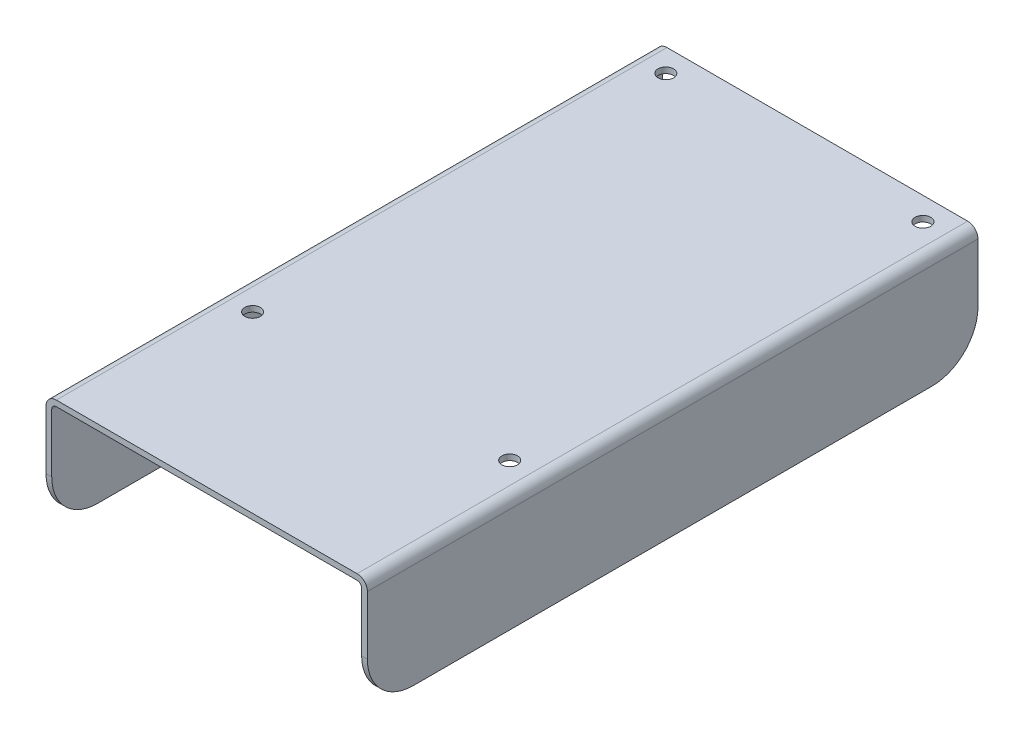
ISO-10303-21;
HEADER;
FILE_DESCRIPTION(('STEP AP214'),'2;1');
FILE_NAME('part.step','',(''),(''),'','','');
FILE_SCHEMA(('AUTOMOTIVE_DESIGN { 1 0 10303 214 1 1 1 1 }'));
ENDSEC;
DATA;
#1=APPLICATION_CONTEXT('core data for automotive mechanical design processes');
#2=APPLICATION_PROTOCOL_DEFINITION('international standard','automotive_design',2000,#1);
#3=PRODUCT_CONTEXT('',#1,'mechanical');
#4=PRODUCT('Part','Part','',(#3));
#5=PRODUCT_RELATED_PRODUCT_CATEGORY('part','',(#4));
#6=PRODUCT_DEFINITION_FORMATION('','',#4);
#7=PRODUCT_DEFINITION_CONTEXT('part definition',#1,'design');
#8=PRODUCT_DEFINITION('design','',#6,#7);
#9=PRODUCT_DEFINITION_SHAPE('','',#8);
#10=(LENGTH_UNIT() NAMED_UNIT(*) SI_UNIT(.MILLI.,.METRE.));
#11=(NAMED_UNIT(*) PLANE_ANGLE_UNIT() SI_UNIT($,.RADIAN.));
#12=(NAMED_UNIT(*) SI_UNIT($,.STERADIAN.) SOLID_ANGLE_UNIT());
#13=UNCERTAINTY_MEASURE_WITH_UNIT(LENGTH_MEASURE(1.E-05),#10,'distance_accuracy_value','');
#14=(GEOMETRIC_REPRESENTATION_CONTEXT(3) GLOBAL_UNCERTAINTY_ASSIGNED_CONTEXT((#13)) GLOBAL_UNIT_ASSIGNED_CONTEXT((#10,
#11,#12)) REPRESENTATION_CONTEXT('',''));
#15=CARTESIAN_POINT('',(0.,0.,0.));
#16=DIRECTION('',(0.,0.,1.));
#17=DIRECTION('',(1.,0.,0.));
#18=AXIS2_PLACEMENT_3D('',#15,#16,#17);
#19=CARTESIAN_POINT('',(-35.,-15.,123.));
#20=DIRECTION('',(1.,0.,0.));
#21=DIRECTION('',(0.,0.,-1.));
#22=AXIS2_PLACEMENT_3D('',#19,#20,#21);
#23=CYLINDRICAL_SURFACE('',#22,9.99999999999999);
#24=CARTESIAN_POINT('',(-33.75,-15.,123.));
#25=DIRECTION('',(1.,0.,0.));
#26=DIRECTION('',(0.,0.,-1.));
#27=AXIS2_PLACEMENT_3D('',#24,#25,#26);
#28=CIRCLE('',#27,9.99999999999999);
#29=CARTESIAN_POINT('',(-33.75,-25.,123.));
#30=VERTEX_POINT('',#29);
#31=CARTESIAN_POINT('',(-33.75,-15.,133.));
#32=VERTEX_POINT('',#31);
#33=EDGE_CURVE('E221',#30,#32,#28,.F.);
#34=ORIENTED_EDGE('',*,*,#33,.T.);
#35=DIRECTION('',(1.,0.,0.));
#36=VECTOR('',#35,1.);
#37=CARTESIAN_POINT('',(-35.,-15.,133.));
#38=LINE('',#37,#36);
#39=CARTESIAN_POINT('',(-35.,-15.,133.));
#40=VERTEX_POINT('',#39);
#41=EDGE_CURVE('E237',#32,#40,#38,.F.);
#42=ORIENTED_EDGE('',*,*,#41,.T.);
#43=CARTESIAN_POINT('',(-35.,-15.,123.));
#44=DIRECTION('',(1.,0.,0.));
#45=DIRECTION('',(0.,0.,-1.));
#46=AXIS2_PLACEMENT_3D('',#43,#44,#45);
#47=CIRCLE('',#46,9.99999999999999);
#48=CARTESIAN_POINT('',(-35.,-25.,123.));
#49=VERTEX_POINT('',#48);
#50=EDGE_CURVE('E213',#40,#49,#47,.T.);
#51=ORIENTED_EDGE('',*,*,#50,.T.);
#52=DIRECTION('',(1.,0.,0.));
#53=VECTOR('',#52,1.);
#54=CARTESIAN_POINT('',(-33.75,-25.,123.));
#55=LINE('',#54,#53);
#56=EDGE_CURVE('E234',#49,#30,#55,.T.);
#57=ORIENTED_EDGE('',*,*,#56,.T.);
#58=EDGE_LOOP('',(#34,#42,#51,#57));
#59=FACE_BOUND('',#58,.T.);
#60=ADVANCED_FACE('F16',(#59),#23,.T.);
#61=CARTESIAN_POINT('',(-33.75,-25.,133.));
#62=DIRECTION('',(0.,1.,0.));
#63=DIRECTION('',(0.,0.,1.));
#64=AXIS2_PLACEMENT_3D('',#61,#62,#63);
#65=PLANE('',#64);
#66=DIRECTION('',(-1.,0.,0.));
#67=VECTOR('',#66,1.);
#68=CARTESIAN_POINT('',(-33.75,-25.,9.99999999999999));
#69=LINE('',#68,#67);
#70=CARTESIAN_POINT('',(-33.75,-25.,9.99999999999999));
#71=VERTEX_POINT('',#70);
#72=CARTESIAN_POINT('',(-35.,-25.,9.99999999999999));
#73=VERTEX_POINT('',#72);
#74=EDGE_CURVE('E230',#71,#73,#69,.T.);
#75=ORIENTED_EDGE('',*,*,#74,.F.);
#76=DIRECTION('',(0.,0.,1.));
#77=VECTOR('',#76,1.);
#78=CARTESIAN_POINT('',(-33.75,-25.,133.));
#79=LINE('',#78,#77);
#80=EDGE_CURVE('E214',#71,#30,#79,.T.);
#81=ORIENTED_EDGE('',*,*,#80,.T.);
#82=ORIENTED_EDGE('',*,*,#56,.F.);
#83=DIRECTION('',(0.,0.,-1.));
#84=VECTOR('',#83,1.);
#85=CARTESIAN_POINT('',(-35.,-25.,133.));
#86=LINE('',#85,#84);
#87=EDGE_CURVE('E209',#49,#73,#86,.T.);
#88=ORIENTED_EDGE('',*,*,#87,.T.);
#89=EDGE_LOOP('',(#75,#81,#82,#88));
#90=FACE_BOUND('',#89,.T.);
#91=ADVANCED_FACE('F499',(#90),#65,.F.);
#92=CARTESIAN_POINT('',(-33.75,-15.,9.99999999999999));
#93=DIRECTION('',(-1.,0.,0.));
#94=DIRECTION('',(0.,0.,1.));
#95=AXIS2_PLACEMENT_3D('',#92,#93,#94);
#96=CYLINDRICAL_SURFACE('',#95,10.);
#97=CARTESIAN_POINT('',(-33.75,-15.,9.99999999999999));
#98=DIRECTION('',(-1.,0.,0.));
#99=DIRECTION('',(0.,0.,1.));
#100=AXIS2_PLACEMENT_3D('',#97,#98,#99);
#101=CIRCLE('',#100,10.);
#102=CARTESIAN_POINT('',(-33.75,-15.,0.));
#103=VERTEX_POINT('',#102);
#104=EDGE_CURVE('E217',#103,#71,#101,.T.);
#105=ORIENTED_EDGE('',*,*,#104,.T.);
#106=ORIENTED_EDGE('',*,*,#74,.T.);
#107=CARTESIAN_POINT('',(-35.,-15.,9.99999999999999));
#108=DIRECTION('',(-1.,0.,0.));
#109=DIRECTION('',(0.,0.,1.));
#110=AXIS2_PLACEMENT_3D('',#107,#108,#109);
#111=CIRCLE('',#110,10.);
#112=CARTESIAN_POINT('',(-35.,-15.,0.));
#113=VERTEX_POINT('',#112);
#114=EDGE_CURVE('E212',#73,#113,#111,.F.);
#115=ORIENTED_EDGE('',*,*,#114,.T.);
#116=DIRECTION('',(-1.,0.,0.));
#117=VECTOR('',#116,1.);
#118=CARTESIAN_POINT('',(-33.75,-15.,0.));
#119=LINE('',#118,#117);
#120=EDGE_CURVE('E232',#113,#103,#119,.F.);
#121=ORIENTED_EDGE('',*,*,#120,.T.);
#122=EDGE_LOOP('',(#105,#106,#115,#121));
#123=FACE_BOUND('',#122,.T.);
#124=ADVANCED_FACE('F491',(#123),#96,.T.);
#125=CARTESIAN_POINT('',(-35.,-15.,123.));
#126=DIRECTION('',(1.,0.,0.));
#127=DIRECTION('',(0.,0.,-1.));
#128=AXIS2_PLACEMENT_3D('',#125,#126,#127);
#129=CYLINDRICAL_SURFACE('',#128,9.99999999999999);
#130=CARTESIAN_POINT('',(35.,-15.,123.));
#131=DIRECTION('',(1.,0.,0.));
#132=DIRECTION('',(0.,0.,-1.));
#133=AXIS2_PLACEMENT_3D('',#130,#131,#132);
#134=CIRCLE('',#133,9.99999999999999);
#135=CARTESIAN_POINT('',(35.,-25.,123.));
#136=VERTEX_POINT('',#135);
#137=CARTESIAN_POINT('',(35.,-15.,133.));
#138=VERTEX_POINT('',#137);
#139=EDGE_CURVE('E264',#136,#138,#134,.F.);
#140=ORIENTED_EDGE('',*,*,#139,.T.);
#141=DIRECTION('',(1.,0.,0.));
#142=VECTOR('',#141,1.);
#143=CARTESIAN_POINT('',(-35.,-15.,133.));
#144=LINE('',#143,#142);
#145=CARTESIAN_POINT('',(33.75,-15.,133.));
#146=VERTEX_POINT('',#145);
#147=EDGE_CURVE('E228',#138,#146,#144,.F.);
#148=ORIENTED_EDGE('',*,*,#147,.T.);
#149=CARTESIAN_POINT('',(33.75,-15.,123.));
#150=DIRECTION('',(1.,0.,0.));
#151=DIRECTION('',(0.,0.,-1.));
#152=AXIS2_PLACEMENT_3D('',#149,#150,#151);
#153=CIRCLE('',#152,9.99999999999999);
#154=CARTESIAN_POINT('',(33.75,-25.,123.));
#155=VERTEX_POINT('',#154);
#156=EDGE_CURVE('E197',#146,#155,#153,.T.);
#157=ORIENTED_EDGE('',*,*,#156,.T.);
#158=DIRECTION('',(1.,0.,0.));
#159=VECTOR('',#158,1.);
#160=CARTESIAN_POINT('',(35.,-25.,123.));
#161=LINE('',#160,#159);
#162=EDGE_CURVE('E225',#155,#136,#161,.T.);
#163=ORIENTED_EDGE('',*,*,#162,.T.);
#164=EDGE_LOOP('',(#140,#148,#157,#163));
#165=FACE_BOUND('',#164,.T.);
#166=ADVANCED_FACE('F287',(#165),#129,.T.);
#167=CARTESIAN_POINT('',(35.,-25.,133.));
#168=DIRECTION('',(0.,1.,0.));
#169=DIRECTION('',(0.,0.,1.));
#170=AXIS2_PLACEMENT_3D('',#167,#168,#169);
#171=PLANE('',#170);
#172=DIRECTION('',(-1.,0.,0.));
#173=VECTOR('',#172,1.);
#174=CARTESIAN_POINT('',(35.,-25.,9.99999999999999));
#175=LINE('',#174,#173);
#176=CARTESIAN_POINT('',(35.,-25.,9.99999999999999));
#177=VERTEX_POINT('',#176);
#178=CARTESIAN_POINT('',(33.75,-25.,9.99999999999999));
#179=VERTEX_POINT('',#178);
#180=EDGE_CURVE('E133',#177,#179,#175,.T.);
#181=ORIENTED_EDGE('',*,*,#180,.F.);
#182=DIRECTION('',(0.,0.,1.));
#183=VECTOR('',#182,1.);
#184=CARTESIAN_POINT('',(35.,-25.,133.));
#185=LINE('',#184,#183);
#186=EDGE_CURVE('E200',#177,#136,#185,.T.);
#187=ORIENTED_EDGE('',*,*,#186,.T.);
#188=ORIENTED_EDGE('',*,*,#162,.F.);
#189=DIRECTION('',(0.,0.,1.));
#190=VECTOR('',#189,1.);
#191=CARTESIAN_POINT('',(33.75,-25.,133.));
#192=LINE('',#191,#190);
#193=EDGE_CURVE('E194',#155,#179,#192,.F.);
#194=ORIENTED_EDGE('',*,*,#193,.T.);
#195=EDGE_LOOP('',(#181,#187,#188,#194));
#196=FACE_BOUND('',#195,.T.);
#197=ADVANCED_FACE('F474',(#196),#171,.F.);
#198=CARTESIAN_POINT('',(35.,-15.,9.99999999999999));
#199=DIRECTION('',(-1.,0.,0.));
#200=DIRECTION('',(0.,0.,1.));
#201=AXIS2_PLACEMENT_3D('',#198,#199,#200);
#202=CYLINDRICAL_SURFACE('',#201,10.);
#203=CARTESIAN_POINT('',(35.,-15.,9.99999999999999));
#204=DIRECTION('',(-1.,0.,0.));
#205=DIRECTION('',(0.,0.,1.));
#206=AXIS2_PLACEMENT_3D('',#203,#204,#205);
#207=CIRCLE('',#206,10.);
#208=CARTESIAN_POINT('',(35.,-15.,0.));
#209=VERTEX_POINT('',#208);
#210=EDGE_CURVE('E203',#209,#177,#207,.T.);
#211=ORIENTED_EDGE('',*,*,#210,.T.);
#212=ORIENTED_EDGE('',*,*,#180,.T.);
#213=CARTESIAN_POINT('',(33.75,-15.,9.99999999999999));
#214=DIRECTION('',(-1.,0.,0.));
#215=DIRECTION('',(0.,0.,1.));
#216=AXIS2_PLACEMENT_3D('',#213,#214,#215);
#217=CIRCLE('',#216,10.);
#218=CARTESIAN_POINT('',(33.75,-15.,0.));
#219=VERTEX_POINT('',#218);
#220=EDGE_CURVE('E141',#179,#219,#217,.F.);
#221=ORIENTED_EDGE('',*,*,#220,.T.);
#222=DIRECTION('',(-1.,0.,0.));
#223=VECTOR('',#222,1.);
#224=CARTESIAN_POINT('',(35.,-15.,0.));
#225=LINE('',#224,#223);
#226=EDGE_CURVE('E223',#219,#209,#225,.F.);
#227=ORIENTED_EDGE('',*,*,#226,.T.);
#228=EDGE_LOOP('',(#211,#212,#221,#227));
#229=FACE_BOUND('',#228,.T.);
#230=ADVANCED_FACE('F328',(#229),#202,.T.);
#231=CARTESIAN_POINT('',(32.75,-2.25,133.));
#232=DIRECTION('',(0.,0.,1.));
#233=DIRECTION('',(1.,0.,0.));
#234=AXIS2_PLACEMENT_3D('',#231,#232,#233);
#235=CYLINDRICAL_SURFACE('',#234,1.);
#236=DIRECTION('',(0.,0.,1.));
#237=VECTOR('',#236,1.);
#238=CARTESIAN_POINT('',(32.75,-1.25,133.));
#239=LINE('',#238,#237);
#240=CARTESIAN_POINT('',(32.75,-1.25,133.));
#241=VERTEX_POINT('',#240);
#242=CARTESIAN_POINT('',(32.75,-1.25,0.));
#243=VERTEX_POINT('',#242);
#244=EDGE_CURVE('E135',#241,#243,#239,.F.);
#245=ORIENTED_EDGE('',*,*,#244,.T.);
#246=CARTESIAN_POINT('',(32.75,-2.25,0.));
#247=DIRECTION('',(0.,0.,1.));
#248=DIRECTION('',(1.,0.,0.));
#249=AXIS2_PLACEMENT_3D('',#246,#247,#248);
#250=CIRCLE('',#249,1.);
#251=CARTESIAN_POINT('',(33.75,-2.25,0.));
#252=VERTEX_POINT('',#251);
#253=EDGE_CURVE('E19',#252,#243,#250,.T.);
#254=ORIENTED_EDGE('',*,*,#253,.F.);
#255=DIRECTION('',(0.,0.,1.));
#256=VECTOR('',#255,1.);
#257=CARTESIAN_POINT('',(33.75,-2.25,133.));
#258=LINE('',#257,#256);
#259=CARTESIAN_POINT('',(33.75,-2.25,133.));
#260=VERTEX_POINT('',#259);
#261=EDGE_CURVE('E198',#252,#260,#258,.T.);
#262=ORIENTED_EDGE('',*,*,#261,.T.);
#263=CARTESIAN_POINT('',(32.75,-2.25,133.));
#264=DIRECTION('',(0.,0.,1.));
#265=DIRECTION('',(1.,0.,0.));
#266=AXIS2_PLACEMENT_3D('',#263,#264,#265);
#267=CIRCLE('',#266,1.);
#268=EDGE_CURVE('E132',#241,#260,#267,.F.);
#269=ORIENTED_EDGE('',*,*,#268,.F.);
#270=EDGE_LOOP('',(#245,#254,#262,#269));
#271=FACE_BOUND('',#270,.T.);
#272=ADVANCED_FACE('F136',(#271),#235,.F.);
#273=CARTESIAN_POINT('',(-32.75,-2.25000000000001,133.));
#274=DIRECTION('',(0.,0.,1.));
#275=DIRECTION('',(1.,0.,0.));
#276=AXIS2_PLACEMENT_3D('',#273,#274,#275);
#277=CYLINDRICAL_SURFACE('',#276,1.);
#278=DIRECTION('',(0.,0.,1.));
#279=VECTOR('',#278,1.);
#280=CARTESIAN_POINT('',(-33.75,-2.25000000000001,133.));
#281=LINE('',#280,#279);
#282=CARTESIAN_POINT('',(-33.75,-2.25000000000001,133.));
#283=VERTEX_POINT('',#282);
#284=CARTESIAN_POINT('',(-33.75,-2.25000000000001,0.));
#285=VERTEX_POINT('',#284);
#286=EDGE_CURVE('E218',#283,#285,#281,.F.);
#287=ORIENTED_EDGE('',*,*,#286,.T.);
#288=CARTESIAN_POINT('',(-32.75,-2.25000000000001,0.));
#289=DIRECTION('',(0.,0.,1.));
#290=DIRECTION('',(1.,0.,0.));
#291=AXIS2_PLACEMENT_3D('',#288,#289,#290);
#292=CIRCLE('',#291,1.);
#293=CARTESIAN_POINT('',(-32.75,-1.25,0.));
#294=VERTEX_POINT('',#293);
#295=EDGE_CURVE('E277',#294,#285,#292,.T.);
#296=ORIENTED_EDGE('',*,*,#295,.F.);
#297=DIRECTION('',(0.,0.,1.));
#298=VECTOR('',#297,1.);
#299=CARTESIAN_POINT('',(-32.75,-1.25000000000001,133.));
#300=LINE('',#299,#298);
#301=CARTESIAN_POINT('',(-32.75,-1.25,133.));
#302=VERTEX_POINT('',#301);
#303=EDGE_CURVE('E140',#294,#302,#300,.T.);
#304=ORIENTED_EDGE('',*,*,#303,.T.);
#305=CARTESIAN_POINT('',(-32.75,-2.25000000000001,133.));
#306=DIRECTION('',(0.,0.,1.));
#307=DIRECTION('',(1.,0.,0.));
#308=AXIS2_PLACEMENT_3D('',#305,#306,#307);
#309=CIRCLE('',#308,1.);
#310=EDGE_CURVE('E275',#283,#302,#309,.F.);
#311=ORIENTED_EDGE('',*,*,#310,.F.);
#312=EDGE_LOOP('',(#287,#296,#304,#311));
#313=FACE_BOUND('',#312,.T.);
#314=ADVANCED_FACE('F319',(#313),#277,.F.);
#315=CARTESIAN_POINT('',(-33.75,-1.25000000000001,133.));
#316=DIRECTION('',(-1.,0.,0.));
#317=DIRECTION('',(0.,0.,1.));
#318=AXIS2_PLACEMENT_3D('',#315,#316,#317);
#319=PLANE('',#318);
#320=ORIENTED_EDGE('',*,*,#104,.F.);
#321=DIRECTION('',(0.,1.,0.));
#322=VECTOR('',#321,1.);
#323=CARTESIAN_POINT('',(-33.75,-25.,0.));
#324=LINE('',#323,#322);
#325=EDGE_CURVE('E160',#285,#103,#324,.F.);
#326=ORIENTED_EDGE('',*,*,#325,.F.);
#327=ORIENTED_EDGE('',*,*,#286,.F.);
#328=DIRECTION('',(0.,1.,0.));
#329=VECTOR('',#328,1.);
#330=CARTESIAN_POINT('',(-33.75,-25.,133.));
#331=LINE('',#330,#329);
#332=EDGE_CURVE('E180',#283,#32,#331,.F.);
#333=ORIENTED_EDGE('',*,*,#332,.T.);
#334=ORIENTED_EDGE('',*,*,#33,.F.);
#335=ORIENTED_EDGE('',*,*,#80,.F.);
#336=EDGE_LOOP('',(#320,#326,#327,#333,#334,#335));
#337=FACE_BOUND('',#336,.T.);
#338=ADVANCED_FACE('F316',(#337),#319,.F.);
#339=CARTESIAN_POINT('',(-35.,-25.,133.));
#340=DIRECTION('',(1.,0.,0.));
#341=DIRECTION('',(0.,0.,-1.));
#342=AXIS2_PLACEMENT_3D('',#339,#340,#341);
#343=PLANE('',#342);
#344=ORIENTED_EDGE('',*,*,#114,.F.);
#345=ORIENTED_EDGE('',*,*,#87,.F.);
#346=ORIENTED_EDGE('',*,*,#50,.F.);
#347=DIRECTION('',(0.,1.,0.));
#348=VECTOR('',#347,1.);
#349=CARTESIAN_POINT('',(-35.,-25.,133.));
#350=LINE('',#349,#348);
#351=CARTESIAN_POINT('',(-35.,-2.25,133.));
#352=VERTEX_POINT('',#351);
#353=EDGE_CURVE('E177',#40,#352,#350,.T.);
#354=ORIENTED_EDGE('',*,*,#353,.T.);
#355=DIRECTION('',(0.,0.,-1.));
#356=VECTOR('',#355,1.);
#357=CARTESIAN_POINT('',(-35.,-2.25,133.));
#358=LINE('',#357,#356);
#359=CARTESIAN_POINT('',(-35.,-2.25,0.));
#360=VERTEX_POINT('',#359);
#361=EDGE_CURVE('E163',#360,#352,#358,.F.);
#362=ORIENTED_EDGE('',*,*,#361,.F.);
#363=DIRECTION('',(0.,1.,0.));
#364=VECTOR('',#363,1.);
#365=CARTESIAN_POINT('',(-35.,-25.,0.));
#366=LINE('',#365,#364);
#367=EDGE_CURVE('E158',#113,#360,#366,.T.);
#368=ORIENTED_EDGE('',*,*,#367,.F.);
#369=EDGE_LOOP('',(#344,#345,#346,#354,#362,#368));
#370=FACE_BOUND('',#369,.T.);
#371=ADVANCED_FACE('F304',(#370),#343,.F.);
#372=CARTESIAN_POINT('',(35.,0.,133.));
#373=DIRECTION('',(-1.,0.,0.));
#374=DIRECTION('',(0.,-1.,0.));
#375=AXIS2_PLACEMENT_3D('',#372,#373,#374);
#376=PLANE('',#375);
#377=ORIENTED_EDGE('',*,*,#210,.F.);
#378=DIRECTION('',(0.,1.,0.));
#379=VECTOR('',#378,1.);
#380=CARTESIAN_POINT('',(35.,-25.,0.));
#381=LINE('',#380,#379);
#382=CARTESIAN_POINT('',(35.,-2.24999999999999,0.));
#383=VERTEX_POINT('',#382);
#384=EDGE_CURVE('E152',#383,#209,#381,.F.);
#385=ORIENTED_EDGE('',*,*,#384,.F.);
#386=DIRECTION('',(0.,0.,-1.));
#387=VECTOR('',#386,1.);
#388=CARTESIAN_POINT('',(35.,-2.24999999999999,133.));
#389=LINE('',#388,#387);
#390=CARTESIAN_POINT('',(35.,-2.24999999999999,133.));
#391=VERTEX_POINT('',#390);
#392=EDGE_CURVE('E204',#391,#383,#389,.T.);
#393=ORIENTED_EDGE('',*,*,#392,.F.);
#394=DIRECTION('',(0.,1.,0.));
#395=VECTOR('',#394,1.);
#396=CARTESIAN_POINT('',(35.,-25.,133.));
#397=LINE('',#396,#395);
#398=EDGE_CURVE('E188',#391,#138,#397,.F.);
#399=ORIENTED_EDGE('',*,*,#398,.T.);
#400=ORIENTED_EDGE('',*,*,#139,.F.);
#401=ORIENTED_EDGE('',*,*,#186,.F.);
#402=EDGE_LOOP('',(#377,#385,#393,#399,#400,#401));
#403=FACE_BOUND('',#402,.T.);
#404=ADVANCED_FACE('F366',(#403),#376,.F.);
#405=CARTESIAN_POINT('',(33.75,-25.,133.));
#406=DIRECTION('',(1.,0.,0.));
#407=DIRECTION('',(0.,1.,0.));
#408=AXIS2_PLACEMENT_3D('',#405,#406,#407);
#409=PLANE('',#408);
#410=ORIENTED_EDGE('',*,*,#220,.F.);
#411=ORIENTED_EDGE('',*,*,#193,.F.);
#412=ORIENTED_EDGE('',*,*,#156,.F.);
#413=DIRECTION('',(0.,1.,0.));
#414=VECTOR('',#413,1.);
#415=CARTESIAN_POINT('',(33.75,-25.,133.));
#416=LINE('',#415,#414);
#417=EDGE_CURVE('E185',#146,#260,#416,.T.);
#418=ORIENTED_EDGE('',*,*,#417,.T.);
#419=ORIENTED_EDGE('',*,*,#261,.F.);
#420=DIRECTION('',(0.,1.,0.));
#421=VECTOR('',#420,1.);
#422=CARTESIAN_POINT('',(33.75,-25.,0.));
#423=LINE('',#422,#421);
#424=EDGE_CURVE('E131',#219,#252,#423,.T.);
#425=ORIENTED_EDGE('',*,*,#424,.F.);
#426=EDGE_LOOP('',(#410,#411,#412,#418,#419,#425));
#427=FACE_BOUND('',#426,.T.);
#428=ADVANCED_FACE('F284',(#427),#409,.F.);
#429=CARTESIAN_POINT('',(33.75,-1.25,133.));
#430=DIRECTION('',(0.,1.,0.));
#431=DIRECTION('',(-1.,0.,0.));
#432=AXIS2_PLACEMENT_3D('',#429,#430,#431);
#433=PLANE('',#432);
#434=ORIENTED_EDGE('',*,*,#303,.F.);
#435=DIRECTION('',(-1.,0.,0.));
#436=VECTOR('',#435,1.);
#437=CARTESIAN_POINT('',(-35.,-1.25,0.));
#438=LINE('',#437,#436);
#439=EDGE_CURVE('E129',#243,#294,#438,.T.);
#440=ORIENTED_EDGE('',*,*,#439,.F.);
#441=ORIENTED_EDGE('',*,*,#244,.F.);
#442=DIRECTION('',(-1.,0.,0.));
#443=VECTOR('',#442,1.);
#444=CARTESIAN_POINT('',(-35.,-1.25,133.));
#445=LINE('',#444,#443);
#446=EDGE_CURVE('E183',#241,#302,#445,.T.);
#447=ORIENTED_EDGE('',*,*,#446,.T.);
#448=EDGE_LOOP('',(#434,#440,#441,#447));
#449=FACE_BOUND('',#448,.T.);
#450=CARTESIAN_POINT('',(-28.,-1.25000000000001,5.));
#451=DIRECTION('',(0.,1.,0.));
#452=DIRECTION('',(0.,0.,1.));
#453=AXIS2_PLACEMENT_3D('',#450,#451,#452);
#454=CIRCLE('',#453,1.7);
#455=CARTESIAN_POINT('',(-28.,-1.25000000000001,6.7));
#456=VERTEX_POINT('',#455);
#457=EDGE_CURVE('E147',#456,#456,#454,.T.);
#458=ORIENTED_EDGE('',*,*,#457,.T.);
#459=EDGE_LOOP('',(#458));
#460=FACE_BOUND('',#459,.T.);
#461=CARTESIAN_POINT('',(-28.,-1.25000000000001,95.));
#462=DIRECTION('',(0.,1.,0.));
#463=DIRECTION('',(0.,0.,1.));
#464=AXIS2_PLACEMENT_3D('',#461,#462,#463);
#465=CIRCLE('',#464,1.70000000000001);
#466=CARTESIAN_POINT('',(-28.,-1.25000000000001,96.7));
#467=VERTEX_POINT('',#466);
#468=EDGE_CURVE('E150',#467,#467,#465,.T.);
#469=ORIENTED_EDGE('',*,*,#468,.T.);
#470=EDGE_LOOP('',(#469));
#471=FACE_BOUND('',#470,.T.);
#472=CARTESIAN_POINT('',(28.,-1.25,95.));
#473=DIRECTION('',(0.,1.,0.));
#474=DIRECTION('',(0.,0.,1.));
#475=AXIS2_PLACEMENT_3D('',#472,#473,#474);
#476=CIRCLE('',#475,1.70000000000001);
#477=CARTESIAN_POINT('',(28.,-1.25,96.7));
#478=VERTEX_POINT('',#477);
#479=EDGE_CURVE('E245',#478,#478,#476,.T.);
#480=ORIENTED_EDGE('',*,*,#479,.T.);
#481=EDGE_LOOP('',(#480));
#482=FACE_BOUND('',#481,.T.);
#483=CARTESIAN_POINT('',(28.,-1.25,5.));
#484=DIRECTION('',(0.,1.,0.));
#485=DIRECTION('',(0.,0.,1.));
#486=AXIS2_PLACEMENT_3D('',#483,#484,#485);
#487=CIRCLE('',#486,1.7);
#488=CARTESIAN_POINT('',(28.,-1.25,6.7));
#489=VERTEX_POINT('',#488);
#490=EDGE_CURVE('E193',#489,#489,#487,.T.);
#491=ORIENTED_EDGE('',*,*,#490,.T.);
#492=EDGE_LOOP('',(#491));
#493=FACE_BOUND('',#492,.T.);
#494=ADVANCED_FACE('F144',(#449,#460,#471,#482,#493),#433,.F.);
#495=CARTESIAN_POINT('',(28.,0.,5.));
#496=DIRECTION('',(0.,1.,0.));
#497=DIRECTION('',(0.,0.,1.));
#498=AXIS2_PLACEMENT_3D('',#495,#496,#497);
#499=CYLINDRICAL_SURFACE('',#498,1.7);
#500=ORIENTED_EDGE('',*,*,#490,.F.);
#501=EDGE_LOOP('',(#500));
#502=FACE_BOUND('',#501,.T.);
#503=CARTESIAN_POINT('',(28.,0.,5.));
#504=DIRECTION('',(0.,1.,0.));
#505=DIRECTION('',(0.,0.,1.));
#506=AXIS2_PLACEMENT_3D('',#503,#504,#505);
#507=CIRCLE('',#506,1.7);
#508=CARTESIAN_POINT('',(28.,0.,6.7));
#509=VERTEX_POINT('',#508);
#510=EDGE_CURVE('E174',#509,#509,#507,.T.);
#511=ORIENTED_EDGE('',*,*,#510,.T.);
#512=EDGE_LOOP('',(#511));
#513=FACE_BOUND('',#512,.T.);
#514=ADVANCED_FACE('F358',(#502,#513),#499,.F.);
#515=CARTESIAN_POINT('',(32.75,-2.24999999999999,133.));
#516=DIRECTION('',(0.,0.,-1.));
#517=DIRECTION('',(-1.,0.,0.));
#518=AXIS2_PLACEMENT_3D('',#515,#516,#517);
#519=CYLINDRICAL_SURFACE('',#518,2.25);
#520=CARTESIAN_POINT('',(32.75,-2.24999999999999,0.));
#521=DIRECTION('',(0.,0.,-1.));
#522=DIRECTION('',(-1.,0.,0.));
#523=AXIS2_PLACEMENT_3D('',#520,#521,#522);
#524=CIRCLE('',#523,2.25);
#525=CARTESIAN_POINT('',(32.75,0.,0.));
#526=VERTEX_POINT('',#525);
#527=EDGE_CURVE('E157',#526,#383,#524,.T.);
#528=ORIENTED_EDGE('',*,*,#527,.F.);
#529=DIRECTION('',(0.,0.,1.));
#530=VECTOR('',#529,1.);
#531=CARTESIAN_POINT('',(32.75,0.,133.));
#532=LINE('',#531,#530);
#533=CARTESIAN_POINT('',(32.75,0.,133.));
#534=VERTEX_POINT('',#533);
#535=EDGE_CURVE('E171',#526,#534,#532,.T.);
#536=ORIENTED_EDGE('',*,*,#535,.T.);
#537=CARTESIAN_POINT('',(32.75,-2.24999999999999,133.));
#538=DIRECTION('',(0.,0.,-1.));
#539=DIRECTION('',(-1.,0.,0.));
#540=AXIS2_PLACEMENT_3D('',#537,#538,#539);
#541=CIRCLE('',#540,2.25);
#542=EDGE_CURVE('E190',#534,#391,#541,.T.);
#543=ORIENTED_EDGE('',*,*,#542,.T.);
#544=ORIENTED_EDGE('',*,*,#392,.T.);
#545=EDGE_LOOP('',(#528,#536,#543,#544));
#546=FACE_BOUND('',#545,.T.);
#547=ADVANCED_FACE('F293',(#546),#519,.T.);
#548=CARTESIAN_POINT('',(-35.,-25.,133.));
#549=DIRECTION('',(0.,0.,-1.));
#550=DIRECTION('',(-1.,0.,0.));
#551=AXIS2_PLACEMENT_3D('',#548,#549,#550);
#552=PLANE('',#551);
#553=ORIENTED_EDGE('',*,*,#41,.F.);
#554=ORIENTED_EDGE('',*,*,#332,.F.);
#555=ORIENTED_EDGE('',*,*,#310,.T.);
#556=ORIENTED_EDGE('',*,*,#446,.F.);
#557=ORIENTED_EDGE('',*,*,#268,.T.);
#558=ORIENTED_EDGE('',*,*,#417,.F.);
#559=ORIENTED_EDGE('',*,*,#147,.F.);
#560=ORIENTED_EDGE('',*,*,#398,.F.);
#561=ORIENTED_EDGE('',*,*,#542,.F.);
#562=DIRECTION('',(1.,0.,0.));
#563=VECTOR('',#562,1.);
#564=CARTESIAN_POINT('',(-35.,0.,133.));
#565=LINE('',#564,#563);
#566=CARTESIAN_POINT('',(-32.75,0.,133.));
#567=VERTEX_POINT('',#566);
#568=EDGE_CURVE('E168',#534,#567,#565,.F.);
#569=ORIENTED_EDGE('',*,*,#568,.T.);
#570=CARTESIAN_POINT('',(-32.75,-2.25,133.));
#571=DIRECTION('',(0.,0.,-1.));
#572=DIRECTION('',(-1.,0.,0.));
#573=AXIS2_PLACEMENT_3D('',#570,#571,#572);
#574=CIRCLE('',#573,2.25);
#575=EDGE_CURVE('E179',#352,#567,#574,.T.);
#576=ORIENTED_EDGE('',*,*,#575,.F.);
#577=ORIENTED_EDGE('',*,*,#353,.F.);
#578=EDGE_LOOP('',(#553,#554,#555,#556,#557,#558,#559,#560,#561,#569,#576,#577));
#579=FACE_BOUND('',#578,.T.);
#580=ADVANCED_FACE('F280',(#579),#552,.F.);
#581=CARTESIAN_POINT('',(-32.75,-2.25,133.));
#582=DIRECTION('',(0.,0.,-1.));
#583=DIRECTION('',(-1.,0.,0.));
#584=AXIS2_PLACEMENT_3D('',#581,#582,#583);
#585=CYLINDRICAL_SURFACE('',#584,2.25);
#586=CARTESIAN_POINT('',(-32.75,-2.25,0.));
#587=DIRECTION('',(0.,0.,-1.));
#588=DIRECTION('',(-1.,0.,0.));
#589=AXIS2_PLACEMENT_3D('',#586,#587,#588);
#590=CIRCLE('',#589,2.25);
#591=CARTESIAN_POINT('',(-32.75,0.,0.));
#592=VERTEX_POINT('',#591);
#593=EDGE_CURVE('E34',#360,#592,#590,.T.);
#594=ORIENTED_EDGE('',*,*,#593,.F.);
#595=ORIENTED_EDGE('',*,*,#361,.T.);
#596=ORIENTED_EDGE('',*,*,#575,.T.);
#597=DIRECTION('',(0.,0.,1.));
#598=VECTOR('',#597,1.);
#599=CARTESIAN_POINT('',(-32.75,0.,133.));
#600=LINE('',#599,#598);
#601=EDGE_CURVE('E164',#567,#592,#600,.F.);
#602=ORIENTED_EDGE('',*,*,#601,.T.);
#603=EDGE_LOOP('',(#594,#595,#596,#602));
#604=FACE_BOUND('',#603,.T.);
#605=ADVANCED_FACE('F309',(#604),#585,.T.);
#606=CARTESIAN_POINT('',(-35.,-25.,0.));
#607=DIRECTION('',(0.,0.,-1.));
#608=DIRECTION('',(-1.,0.,0.));
#609=AXIS2_PLACEMENT_3D('',#606,#607,#608);
#610=PLANE('',#609);
#611=ORIENTED_EDGE('',*,*,#439,.T.);
#612=ORIENTED_EDGE('',*,*,#295,.T.);
#613=ORIENTED_EDGE('',*,*,#325,.T.);
#614=ORIENTED_EDGE('',*,*,#120,.F.);
#615=ORIENTED_EDGE('',*,*,#367,.T.);
#616=ORIENTED_EDGE('',*,*,#593,.T.);
#617=DIRECTION('',(1.,0.,0.));
#618=VECTOR('',#617,1.);
#619=CARTESIAN_POINT('',(-35.,0.,0.));
#620=LINE('',#619,#618);
#621=EDGE_CURVE('E167',#592,#526,#620,.T.);
#622=ORIENTED_EDGE('',*,*,#621,.T.);
#623=ORIENTED_EDGE('',*,*,#527,.T.);
#624=ORIENTED_EDGE('',*,*,#384,.T.);
#625=ORIENTED_EDGE('',*,*,#226,.F.);
#626=ORIENTED_EDGE('',*,*,#424,.T.);
#627=ORIENTED_EDGE('',*,*,#253,.T.);
#628=EDGE_LOOP('',(#611,#612,#613,#614,#615,#616,#622,#623,#624,#625,#626,#627));
#629=FACE_BOUND('',#628,.T.);
#630=ADVANCED_FACE('F127',(#629),#610,.T.);
#631=CARTESIAN_POINT('',(-28.,0.,5.));
#632=DIRECTION('',(0.,1.,0.));
#633=DIRECTION('',(0.,0.,1.));
#634=AXIS2_PLACEMENT_3D('',#631,#632,#633);
#635=CYLINDRICAL_SURFACE('',#634,1.7);
#636=ORIENTED_EDGE('',*,*,#457,.F.);
#637=EDGE_LOOP('',(#636));
#638=FACE_BOUND('',#637,.T.);
#639=CARTESIAN_POINT('',(-28.,0.,5.));
#640=DIRECTION('',(0.,1.,0.));
#641=DIRECTION('',(0.,0.,1.));
#642=AXIS2_PLACEMENT_3D('',#639,#640,#641);
#643=CIRCLE('',#642,1.7);
#644=CARTESIAN_POINT('',(-28.,0.,6.7));
#645=VERTEX_POINT('',#644);
#646=EDGE_CURVE('E170',#645,#645,#643,.T.);
#647=ORIENTED_EDGE('',*,*,#646,.T.);
#648=EDGE_LOOP('',(#647));
#649=FACE_BOUND('',#648,.T.);
#650=ADVANCED_FACE('F345',(#638,#649),#635,.F.);
#651=CARTESIAN_POINT('',(-28.,0.,95.));
#652=DIRECTION('',(0.,1.,0.));
#653=DIRECTION('',(0.,0.,1.));
#654=AXIS2_PLACEMENT_3D('',#651,#652,#653);
#655=CYLINDRICAL_SURFACE('',#654,1.70000000000001);
#656=ORIENTED_EDGE('',*,*,#468,.F.);
#657=EDGE_LOOP('',(#656));
#658=FACE_BOUND('',#657,.T.);
#659=CARTESIAN_POINT('',(-28.,0.,95.));
#660=DIRECTION('',(0.,1.,0.));
#661=DIRECTION('',(0.,0.,1.));
#662=AXIS2_PLACEMENT_3D('',#659,#660,#661);
#663=CIRCLE('',#662,1.70000000000001);
#664=CARTESIAN_POINT('',(-28.,0.,96.7));
#665=VERTEX_POINT('',#664);
#666=EDGE_CURVE('E25',#665,#665,#663,.T.);
#667=ORIENTED_EDGE('',*,*,#666,.T.);
#668=EDGE_LOOP('',(#667));
#669=FACE_BOUND('',#668,.T.);
#670=ADVANCED_FACE('F337',(#658,#669),#655,.F.);
#671=CARTESIAN_POINT('',(28.,0.,95.));
#672=DIRECTION('',(0.,1.,0.));
#673=DIRECTION('',(0.,0.,1.));
#674=AXIS2_PLACEMENT_3D('',#671,#672,#673);
#675=CYLINDRICAL_SURFACE('',#674,1.70000000000001);
#676=ORIENTED_EDGE('',*,*,#479,.F.);
#677=EDGE_LOOP('',(#676));
#678=FACE_BOUND('',#677,.T.);
#679=CARTESIAN_POINT('',(28.,0.,95.));
#680=DIRECTION('',(0.,1.,0.));
#681=DIRECTION('',(0.,0.,1.));
#682=AXIS2_PLACEMENT_3D('',#679,#680,#681);
#683=CIRCLE('',#682,1.70000000000001);
#684=CARTESIAN_POINT('',(28.,0.,96.7));
#685=VERTEX_POINT('',#684);
#686=EDGE_CURVE('E11',#685,#685,#683,.T.);
#687=ORIENTED_EDGE('',*,*,#686,.T.);
#688=EDGE_LOOP('',(#687));
#689=FACE_BOUND('',#688,.T.);
#690=ADVANCED_FACE('F331',(#678,#689),#675,.F.);
#691=CARTESIAN_POINT('',(-35.,0.,133.));
#692=DIRECTION('',(0.,-1.,0.));
#693=DIRECTION('',(1.,0.,0.));
#694=AXIS2_PLACEMENT_3D('',#691,#692,#693);
#695=PLANE('',#694);
#696=ORIENTED_EDGE('',*,*,#686,.F.);
#697=EDGE_LOOP('',(#696));
#698=FACE_BOUND('',#697,.T.);
#699=ORIENTED_EDGE('',*,*,#666,.F.);
#700=EDGE_LOOP('',(#699));
#701=FACE_BOUND('',#700,.T.);
#702=ORIENTED_EDGE('',*,*,#646,.F.);
#703=EDGE_LOOP('',(#702));
#704=FACE_BOUND('',#703,.T.);
#705=ORIENTED_EDGE('',*,*,#601,.F.);
#706=ORIENTED_EDGE('',*,*,#568,.F.);
#707=ORIENTED_EDGE('',*,*,#535,.F.);
#708=ORIENTED_EDGE('',*,*,#621,.F.);
#709=EDGE_LOOP('',(#705,#706,#707,#708));
#710=FACE_BOUND('',#709,.T.);
#711=ORIENTED_EDGE('',*,*,#510,.F.);
#712=EDGE_LOOP('',(#711));
#713=FACE_BOUND('',#712,.T.);
#714=ADVANCED_FACE('F297',(#698,#701,#704,#710,#713),#695,.F.);
#715=CLOSED_SHELL('',(#60,#91,#124,#166,#197,#230,#272,#314,#338,#371,#404,#428,#494,#514,#547,
#580,#605,#630,#650,#670,#690,#714));
#716=MANIFOLD_SOLID_BREP('B1',#715);
#717=ADVANCED_BREP_SHAPE_REPRESENTATION('',(#18,#716),#14);
#718=SHAPE_DEFINITION_REPRESENTATION(#9,#717);
ENDSEC;
END-ISO-10303-21;
